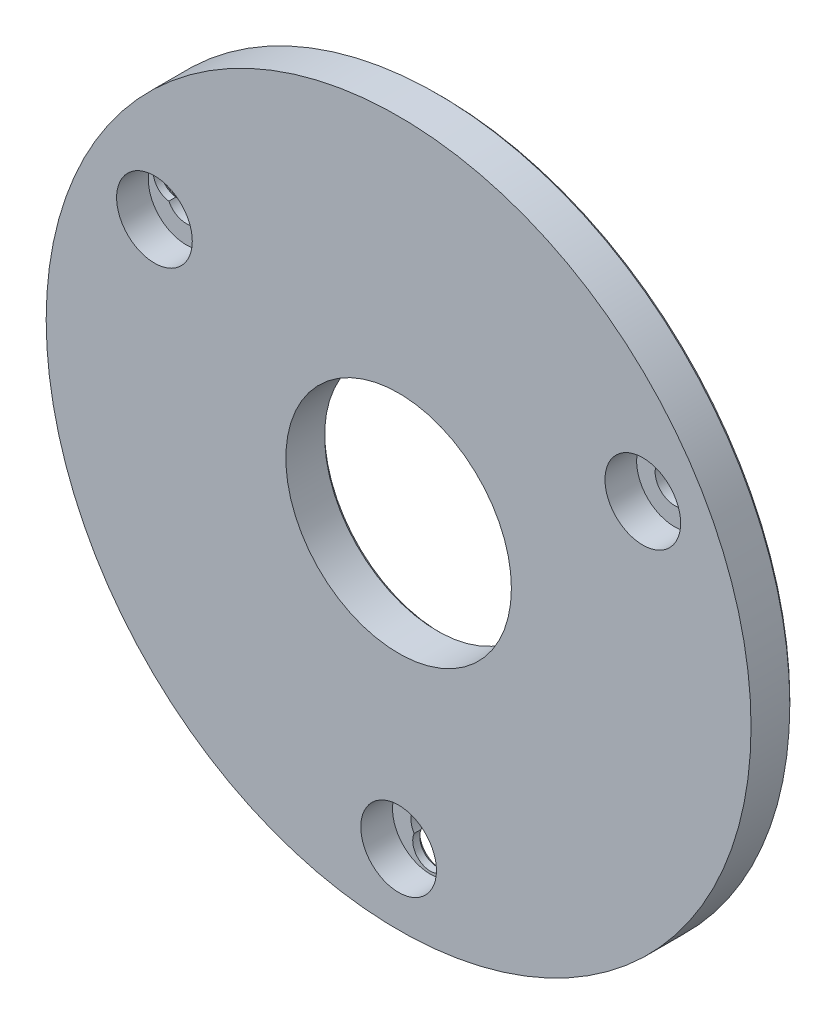
ISO-10303-21;
HEADER;
FILE_DESCRIPTION(('STEP AP214'),'2;1');
FILE_NAME('part.step','',(''),(''),'','','');
FILE_SCHEMA(('AUTOMOTIVE_DESIGN { 1 0 10303 214 1 1 1 1 }'));
ENDSEC;
DATA;
#1=APPLICATION_CONTEXT('core data for automotive mechanical design processes');
#2=APPLICATION_PROTOCOL_DEFINITION('international standard','automotive_design',2000,#1);
#3=PRODUCT_CONTEXT('',#1,'mechanical');
#4=PRODUCT('Part','Part','',(#3));
#5=PRODUCT_RELATED_PRODUCT_CATEGORY('part','',(#4));
#6=PRODUCT_DEFINITION_FORMATION('','',#4);
#7=PRODUCT_DEFINITION_CONTEXT('part definition',#1,'design');
#8=PRODUCT_DEFINITION('design','',#6,#7);
#9=PRODUCT_DEFINITION_SHAPE('','',#8);
#10=(LENGTH_UNIT() NAMED_UNIT(*) SI_UNIT(.MILLI.,.METRE.));
#11=(NAMED_UNIT(*) PLANE_ANGLE_UNIT() SI_UNIT($,.RADIAN.));
#12=(NAMED_UNIT(*) SI_UNIT($,.STERADIAN.) SOLID_ANGLE_UNIT());
#13=UNCERTAINTY_MEASURE_WITH_UNIT(LENGTH_MEASURE(1.E-05),#10,'distance_accuracy_value','');
#14=(GEOMETRIC_REPRESENTATION_CONTEXT(3) GLOBAL_UNCERTAINTY_ASSIGNED_CONTEXT((#13)) GLOBAL_UNIT_ASSIGNED_CONTEXT((#10,
#11,#12)) REPRESENTATION_CONTEXT('',''));
#15=CARTESIAN_POINT('',(0.,0.,0.));
#16=DIRECTION('',(0.,0.,1.));
#17=DIRECTION('',(1.,0.,0.));
#18=AXIS2_PLACEMENT_3D('',#15,#16,#17);
#19=CARTESIAN_POINT('',(0.,0.,12.));
#20=DIRECTION('',(0.,0.,1.));
#21=DIRECTION('',(1.,0.,0.));
#22=AXIS2_PLACEMENT_3D('',#19,#20,#21);
#23=PLANE('',#22);
#24=CARTESIAN_POINT('',(-69.2819235902142,40.0001882950536,12.));
#25=DIRECTION('',(0.,0.,1.));
#26=DIRECTION('',(1.,0.,0.));
#27=AXIS2_PLACEMENT_3D('',#24,#25,#26);
#28=CIRCLE('',#27,10.7375);
#29=CARTESIAN_POINT('',(-58.5444235902142,40.0001882950536,12.));
#30=VERTEX_POINT('',#29);
#31=EDGE_CURVE('E320',#30,#30,#28,.T.);
#32=ORIENTED_EDGE('',*,*,#31,.F.);
#33=EDGE_LOOP('',(#32));
#34=FACE_BOUND('',#33,.T.);
#35=CARTESIAN_POINT('',(-0.000217424570571681,-79.9999999997045,12.));
#36=DIRECTION('',(0.,0.,1.));
#37=DIRECTION('',(1.,0.,0.));
#38=AXIS2_PLACEMENT_3D('',#35,#36,#37);
#39=CIRCLE('',#38,10.7375);
#40=CARTESIAN_POINT('',(10.7372825754294,-79.9999999997045,12.));
#41=VERTEX_POINT('',#40);
#42=EDGE_CURVE('E311',#41,#41,#39,.T.);
#43=ORIENTED_EDGE('',*,*,#42,.F.);
#44=EDGE_LOOP('',(#43));
#45=FACE_BOUND('',#44,.T.);
#46=CARTESIAN_POINT('',(69.2821410147845,39.9998117046507,12.));
#47=DIRECTION('',(0.,0.,1.));
#48=DIRECTION('',(1.,0.,0.));
#49=AXIS2_PLACEMENT_3D('',#46,#47,#48);
#50=CIRCLE('',#49,10.7375);
#51=CARTESIAN_POINT('',(80.0196410147845,39.9998117046507,12.));
#52=VERTEX_POINT('',#51);
#53=EDGE_CURVE('E235',#52,#52,#50,.T.);
#54=ORIENTED_EDGE('',*,*,#53,.F.);
#55=EDGE_LOOP('',(#54));
#56=FACE_BOUND('',#55,.T.);
#57=CARTESIAN_POINT('',(0.,0.,12.));
#58=DIRECTION('',(0.,0.,1.));
#59=DIRECTION('',(1.,0.,0.));
#60=AXIS2_PLACEMENT_3D('',#57,#58,#59);
#61=CIRCLE('',#60,32.);
#62=CARTESIAN_POINT('',(32.,0.,12.));
#63=VERTEX_POINT('',#62);
#64=EDGE_CURVE('E254',#63,#63,#61,.T.);
#65=ORIENTED_EDGE('',*,*,#64,.F.);
#66=EDGE_LOOP('',(#65));
#67=FACE_BOUND('',#66,.T.);
#68=CARTESIAN_POINT('',(0.,0.,12.));
#69=DIRECTION('',(0.,0.,1.));
#70=DIRECTION('',(1.,0.,0.));
#71=AXIS2_PLACEMENT_3D('',#68,#69,#70);
#72=CIRCLE('',#71,100.);
#73=CARTESIAN_POINT('',(100.,0.,12.));
#74=VERTEX_POINT('',#73);
#75=EDGE_CURVE('E257',#74,#74,#72,.T.);
#76=ORIENTED_EDGE('',*,*,#75,.T.);
#77=EDGE_LOOP('',(#76));
#78=FACE_BOUND('',#77,.T.);
#79=ADVANCED_FACE('F35',(#34,#45,#56,#67,#78),#23,.T.);
#80=CARTESIAN_POINT('',(0.,0.,0.));
#81=DIRECTION('',(0.,0.,1.));
#82=DIRECTION('',(1.,0.,0.));
#83=AXIS2_PLACEMENT_3D('',#80,#81,#82);
#84=PLANE('',#83);
#85=CARTESIAN_POINT('',(1.42646739274691E-12,-84.9999999999993,0.));
#86=DIRECTION('',(0.,0.,1.));
#87=DIRECTION('',(1.,0.,0.));
#88=AXIS2_PLACEMENT_3D('',#85,#86,#87);
#89=CIRCLE('',#88,5.99999999999995);
#90=CARTESIAN_POINT('',(-5.15225705876379,-81.9252240406157,0.));
#91=VERTEX_POINT('',#90);
#92=CARTESIAN_POINT('',(5.15198962654319,-81.9247759613307,0.));
#93=VERTEX_POINT('',#92);
#94=EDGE_CURVE('E121',#91,#93,#89,.T.);
#95=ORIENTED_EDGE('',*,*,#94,.T.);
#96=CARTESIAN_POINT('',(-0.000217424570571681,-79.9999999997045,0.));
#97=DIRECTION('',(0.,0.,1.));
#98=DIRECTION('',(1.,0.,0.));
#99=AXIS2_PLACEMENT_3D('',#96,#97,#98);
#100=CIRCLE('',#99,5.50000000000001);
#101=EDGE_CURVE('E58',#93,#91,#100,.T.);
#102=ORIENTED_EDGE('',*,*,#101,.T.);
#103=EDGE_LOOP('',(#95,#102));
#104=FACE_BOUND('',#103,.T.);
#105=CARTESIAN_POINT('',(-73.6121593216774,42.4999999999998,0.));
#106=DIRECTION('',(0.,0.,1.));
#107=DIRECTION('',(1.,0.,0.));
#108=AXIS2_PLACEMENT_3D('',#105,#106,#107);
#109=CIRCLE('',#108,5.99999999999989);
#110=CARTESIAN_POINT('',(-68.373196700522,45.4245975200246,0.));
#111=VERTEX_POINT('',#110);
#112=CARTESIAN_POINT('',(-73.5249319951342,36.5006340840464,0.));
#113=VERTEX_POINT('',#112);
#114=EDGE_CURVE('E116',#111,#113,#109,.T.);
#115=ORIENTED_EDGE('',*,*,#114,.T.);
#116=CARTESIAN_POINT('',(-69.2819235902142,40.0001882950536,0.));
#117=DIRECTION('',(0.,0.,1.));
#118=DIRECTION('',(1.,0.,0.));
#119=AXIS2_PLACEMENT_3D('',#116,#117,#118);
#120=CIRCLE('',#119,5.50000000000001);
#121=EDGE_CURVE('E50',#113,#111,#120,.T.);
#122=ORIENTED_EDGE('',*,*,#121,.T.);
#123=EDGE_LOOP('',(#115,#122));
#124=FACE_BOUND('',#123,.T.);
#125=CARTESIAN_POINT('',(73.6121593216772,42.5000000000016,0.));
#126=DIRECTION('',(0.,0.,1.));
#127=DIRECTION('',(1.,0.,0.));
#128=AXIS2_PLACEMENT_3D('',#125,#126,#127);
#129=CIRCLE('',#128,5.99999999999998);
#130=CARTESIAN_POINT('',(73.5254537592873,36.5006265205914,0.));
#131=VERTEX_POINT('',#130);
#132=CARTESIAN_POINT('',(68.3729423685902,45.4241418772857,0.));
#133=VERTEX_POINT('',#132);
#134=EDGE_CURVE('E122',#131,#133,#129,.T.);
#135=ORIENTED_EDGE('',*,*,#134,.T.);
#136=CARTESIAN_POINT('',(69.2821410147845,39.9998117046507,0.));
#137=DIRECTION('',(0.,0.,1.));
#138=DIRECTION('',(1.,0.,0.));
#139=AXIS2_PLACEMENT_3D('',#136,#137,#138);
#140=CIRCLE('',#139,5.50000000000001);
#141=EDGE_CURVE('E247',#133,#131,#140,.T.);
#142=ORIENTED_EDGE('',*,*,#141,.T.);
#143=EDGE_LOOP('',(#135,#142));
#144=FACE_BOUND('',#143,.T.);
#145=CARTESIAN_POINT('',(0.,0.,0.));
#146=DIRECTION('',(0.,0.,1.));
#147=DIRECTION('',(1.,0.,0.));
#148=AXIS2_PLACEMENT_3D('',#145,#146,#147);
#149=CIRCLE('',#148,32.9999999999999);
#150=CARTESIAN_POINT('',(32.9999999999999,0.,0.));
#151=VERTEX_POINT('',#150);
#152=EDGE_CURVE('E128',#151,#151,#149,.T.);
#153=ORIENTED_EDGE('',*,*,#152,.T.);
#154=EDGE_LOOP('',(#153));
#155=FACE_BOUND('',#154,.T.);
#156=CARTESIAN_POINT('',(0.,0.,0.));
#157=DIRECTION('',(0.,0.,1.));
#158=DIRECTION('',(1.,0.,0.));
#159=AXIS2_PLACEMENT_3D('',#156,#157,#158);
#160=CIRCLE('',#159,99.);
#161=CARTESIAN_POINT('',(99.,0.,0.));
#162=VERTEX_POINT('',#161);
#163=EDGE_CURVE('E260',#162,#162,#160,.F.);
#164=ORIENTED_EDGE('',*,*,#163,.T.);
#165=EDGE_LOOP('',(#164));
#166=FACE_BOUND('',#165,.T.);
#167=ADVANCED_FACE('F114',(#104,#124,#144,#155,#166),#84,.F.);
#168=CARTESIAN_POINT('',(0.,0.,12.));
#169=DIRECTION('',(0.,0.,-1.));
#170=DIRECTION('',(-1.,0.,0.));
#171=AXIS2_PLACEMENT_3D('',#168,#169,#170);
#172=CYLINDRICAL_SURFACE('',#171,100.);
#173=CARTESIAN_POINT('',(0.,0.,0.999999999999959));
#174=DIRECTION('',(0.,0.,1.));
#175=DIRECTION('',(1.,0.,0.));
#176=AXIS2_PLACEMENT_3D('',#173,#174,#175);
#177=CIRCLE('',#176,100.);
#178=CARTESIAN_POINT('',(100.,0.,0.999999999999959));
#179=VERTEX_POINT('',#178);
#180=EDGE_CURVE('E142',#179,#179,#177,.T.);
#181=ORIENTED_EDGE('',*,*,#180,.T.);
#182=EDGE_LOOP('',(#181));
#183=FACE_BOUND('',#182,.T.);
#184=ORIENTED_EDGE('',*,*,#75,.F.);
#185=EDGE_LOOP('',(#184));
#186=FACE_BOUND('',#185,.T.);
#187=ADVANCED_FACE('F185',(#183,#186),#172,.T.);
#188=CARTESIAN_POINT('',(0.,0.,12.));
#189=DIRECTION('',(0.,0.,-1.));
#190=DIRECTION('',(-1.,0.,0.));
#191=AXIS2_PLACEMENT_3D('',#188,#189,#190);
#192=CYLINDRICAL_SURFACE('',#191,32.);
#193=CARTESIAN_POINT('',(0.,0.,0.999999999999952));
#194=DIRECTION('',(0.,0.,1.));
#195=DIRECTION('',(1.,0.,0.));
#196=AXIS2_PLACEMENT_3D('',#193,#194,#195);
#197=CIRCLE('',#196,32.);
#198=CARTESIAN_POINT('',(32.,0.,0.999999999999952));
#199=VERTEX_POINT('',#198);
#200=EDGE_CURVE('E139',#199,#199,#197,.F.);
#201=ORIENTED_EDGE('',*,*,#200,.T.);
#202=EDGE_LOOP('',(#201));
#203=FACE_BOUND('',#202,.T.);
#204=ORIENTED_EDGE('',*,*,#64,.T.);
#205=EDGE_LOOP('',(#204));
#206=FACE_BOUND('',#205,.T.);
#207=ADVANCED_FACE('F181',(#203,#206),#192,.F.);
#208=CARTESIAN_POINT('',(-73.6121593216774,42.4999999999998,12.));
#209=DIRECTION('',(0.,0.,-1.));
#210=DIRECTION('',(-1.,0.,0.));
#211=AXIS2_PLACEMENT_3D('',#208,#209,#210);
#212=CYLINDRICAL_SURFACE('',#211,4.99999999999998);
#213=DIRECTION('',(0.,0.,1.));
#214=VECTOR('',#213,1.);
#215=CARTESIAN_POINT('',(-74.1982460204323,37.5344685700779,1.49999999999999));
#216=LINE('',#215,#214);
#217=CARTESIAN_POINT('',(-74.1982460204323,37.5344685700779,0.999999999999932));
#218=VERTEX_POINT('',#217);
#219=CARTESIAN_POINT('',(-74.1982460204323,37.5344685700779,2.99999999999998));
#220=VERTEX_POINT('',#219);
#221=EDGE_CURVE('E117',#218,#220,#216,.T.);
#222=ORIENTED_EDGE('',*,*,#221,.F.);
#223=CARTESIAN_POINT('',(-73.6121593216774,42.4999999999998,0.999999999999931));
#224=DIRECTION('',(0.,0.,1.));
#225=DIRECTION('',(1.,0.,0.));
#226=AXIS2_PLACEMENT_3D('',#223,#224,#225);
#227=CIRCLE('',#226,4.99999999999998);
#228=CARTESIAN_POINT('',(-69.6051863932397,45.4906801819596,0.999999999999935));
#229=VERTEX_POINT('',#228);
#230=EDGE_CURVE('E134',#218,#229,#227,.F.);
#231=ORIENTED_EDGE('',*,*,#230,.T.);
#232=DIRECTION('',(0.,0.,1.));
#233=VECTOR('',#232,1.);
#234=CARTESIAN_POINT('',(-69.6051863932397,45.4906801819596,1.49999999999999));
#235=LINE('',#234,#233);
#236=CARTESIAN_POINT('',(-69.6051863932397,45.4906801819596,2.99999999999998));
#237=VERTEX_POINT('',#236);
#238=EDGE_CURVE('E106',#237,#229,#235,.F.);
#239=ORIENTED_EDGE('',*,*,#238,.F.);
#240=CARTESIAN_POINT('',(-73.6121593216774,42.4999999999998,2.99999999999998));
#241=DIRECTION('',(0.,0.,-1.));
#242=DIRECTION('',(-1.,0.,0.));
#243=AXIS2_PLACEMENT_3D('',#240,#241,#242);
#244=CIRCLE('',#243,4.99999999999998);
#245=EDGE_CURVE('E11',#220,#237,#244,.T.);
#246=ORIENTED_EDGE('',*,*,#245,.F.);
#247=EDGE_LOOP('',(#222,#231,#239,#246));
#248=FACE_BOUND('',#247,.T.);
#249=ADVANCED_FACE('F177',(#248),#212,.F.);
#250=CARTESIAN_POINT('',(73.6121593216772,42.5000000000016,12.));
#251=DIRECTION('',(0.,0.,-1.));
#252=DIRECTION('',(-1.,0.,0.));
#253=AXIS2_PLACEMENT_3D('',#250,#251,#252);
#254=CYLINDRICAL_SURFACE('',#253,5.00000000000001);
#255=DIRECTION('',(0.,0.,1.));
#256=VECTOR('',#255,1.);
#257=CARTESIAN_POINT('',(69.6049263094508,45.4903316849027,1.49999999999999));
#258=LINE('',#257,#256);
#259=CARTESIAN_POINT('',(69.6049263094508,45.4903316849027,0.999999999999962));
#260=VERTEX_POINT('',#259);
#261=CARTESIAN_POINT('',(69.6049263094508,45.4903316849027,2.99999999999998));
#262=VERTEX_POINT('',#261);
#263=EDGE_CURVE('E250',#260,#262,#258,.T.);
#264=ORIENTED_EDGE('',*,*,#263,.F.);
#265=CARTESIAN_POINT('',(73.6121593216772,42.5000000000016,0.999999999999963));
#266=DIRECTION('',(0.,0.,1.));
#267=DIRECTION('',(1.,0.,0.));
#268=AXIS2_PLACEMENT_3D('',#265,#266,#267);
#269=CIRCLE('',#268,5.00000000000001);
#270=CARTESIAN_POINT('',(74.1986778696311,37.5345195607182,0.999999999999962));
#271=VERTEX_POINT('',#270);
#272=EDGE_CURVE('E136',#260,#271,#269,.F.);
#273=ORIENTED_EDGE('',*,*,#272,.T.);
#274=DIRECTION('',(0.,0.,1.));
#275=VECTOR('',#274,1.);
#276=CARTESIAN_POINT('',(74.1986778696311,37.5345195607182,1.49999999999999));
#277=LINE('',#276,#275);
#278=CARTESIAN_POINT('',(74.1986778696311,37.5345195607182,2.99999999999998));
#279=VERTEX_POINT('',#278);
#280=EDGE_CURVE('E252',#279,#271,#277,.F.);
#281=ORIENTED_EDGE('',*,*,#280,.F.);
#282=CARTESIAN_POINT('',(73.6121593216772,42.5000000000016,2.99999999999998));
#283=DIRECTION('',(0.,0.,-1.));
#284=DIRECTION('',(-1.,0.,0.));
#285=AXIS2_PLACEMENT_3D('',#282,#283,#284);
#286=CIRCLE('',#285,5.00000000000001);
#287=EDGE_CURVE('E290',#262,#279,#286,.T.);
#288=ORIENTED_EDGE('',*,*,#287,.F.);
#289=EDGE_LOOP('',(#264,#273,#281,#288));
#290=FACE_BOUND('',#289,.T.);
#291=ADVANCED_FACE('F173',(#290),#254,.F.);
#292=CARTESIAN_POINT('',(1.42646739274691E-12,-84.9999999999993,12.));
#293=DIRECTION('',(0.,0.,-1.));
#294=DIRECTION('',(-1.,0.,0.));
#295=AXIS2_PLACEMENT_3D('',#292,#293,#294);
#296=CYLINDRICAL_SURFACE('',#295,5.);
#297=DIRECTION('',(0.,0.,1.));
#298=VECTOR('',#297,1.);
#299=CARTESIAN_POINT('',(4.5933197109809,-83.0248002549792,1.49999999999999));
#300=LINE('',#299,#298);
#301=CARTESIAN_POINT('',(4.5933197109809,-83.0248002549792,0.999999999999958));
#302=VERTEX_POINT('',#301);
#303=CARTESIAN_POINT('',(4.5933197109809,-83.0248002549792,2.99999999999998));
#304=VERTEX_POINT('',#303);
#305=EDGE_CURVE('E241',#302,#304,#300,.T.);
#306=ORIENTED_EDGE('',*,*,#305,.F.);
#307=CARTESIAN_POINT('',(1.42646739274691E-12,-84.9999999999993,0.999999999999956));
#308=DIRECTION('',(0.,0.,1.));
#309=DIRECTION('',(1.,0.,0.));
#310=AXIS2_PLACEMENT_3D('',#307,#308,#309);
#311=CIRCLE('',#310,5.);
#312=CARTESIAN_POINT('',(-4.59349147639002,-83.0251997426773,0.999999999999957));
#313=VERTEX_POINT('',#312);
#314=EDGE_CURVE('E125',#302,#313,#311,.F.);
#315=ORIENTED_EDGE('',*,*,#314,.T.);
#316=DIRECTION('',(0.,0.,1.));
#317=VECTOR('',#316,1.);
#318=CARTESIAN_POINT('',(-4.59349147639002,-83.0251997426773,1.49999999999999));
#319=LINE('',#318,#317);
#320=CARTESIAN_POINT('',(-4.59349147639002,-83.0251997426773,2.99999999999998));
#321=VERTEX_POINT('',#320);
#322=EDGE_CURVE('E237',#321,#313,#319,.F.);
#323=ORIENTED_EDGE('',*,*,#322,.F.);
#324=CARTESIAN_POINT('',(1.42646739274691E-12,-84.9999999999993,2.99999999999998));
#325=DIRECTION('',(0.,0.,-1.));
#326=DIRECTION('',(-1.,0.,0.));
#327=AXIS2_PLACEMENT_3D('',#324,#325,#326);
#328=CIRCLE('',#327,5.);
#329=EDGE_CURVE('E213',#304,#321,#328,.T.);
#330=ORIENTED_EDGE('',*,*,#329,.F.);
#331=EDGE_LOOP('',(#306,#315,#323,#330));
#332=FACE_BOUND('',#331,.T.);
#333=ADVANCED_FACE('F168',(#332),#296,.F.);
#334=CARTESIAN_POINT('',(1.42646739274691E-12,-84.9999999999993,0.));
#335=DIRECTION('',(0.,0.,-1.));
#336=DIRECTION('',(-1.,0.,0.));
#337=AXIS2_PLACEMENT_3D('',#334,#335,#336);
#338=CONICAL_SURFACE('',#337,5.99999999999995,0.785398163397443);
#339=CARTESIAN_POINT('',(-4.59335975353036,-83.0253997329494,1.00020000000003));
#340=CARTESIAN_POINT('',(-4.64938518841113,-82.9403447745221,0.915137248182695));
#341=CARTESIAN_POINT('',(-4.70321417607477,-82.8534762334235,0.830435653427261));
#342=CARTESIAN_POINT('',(-4.80614415923721,-82.6764762240691,0.661985130890068));
#343=CARTESIAN_POINT('',(-4.85525427376078,-82.5863515319141,0.578234653184144));
#344=CARTESIAN_POINT('',(-4.948635825718,-82.4028633517617,0.411577856923276));
#345=CARTESIAN_POINT('',(-4.99290710673725,-82.3094997591958,0.328671565735015));
#346=CARTESIAN_POINT('',(-5.07646155801662,-82.119560171441,0.163611086659927));
#347=CARTESIAN_POINT('',(-5.11573469359752,-82.0229781901647,0.0814587097540616));
#348=CARTESIAN_POINT('',(-5.15234673609067,-81.9249840405151,-0.000200000000152951));
#349=B_SPLINE_CURVE_WITH_KNOTS('',3,(#339,#340,#341,#342,#343,#344,#345,#346,#347,#348),
.UNSPECIFIED.,.F.,.F.,(4,2,2,2,4),(0.,0.398069414421475,0.795353416916052,1.19265025774677,
1.59073256587031),.UNSPECIFIED.);
#350=EDGE_CURVE('E208',#313,#91,#349,.T.);
#351=ORIENTED_EDGE('',*,*,#350,.F.);
#352=ORIENTED_EDGE('',*,*,#314,.F.);
#353=CARTESIAN_POINT('',(5.15207928299696,-81.9245359534318,-0.000200000000149351));
#354=CARTESIAN_POINT('',(5.11547576317667,-82.0225332868538,0.0814587097540694));
#355=CARTESIAN_POINT('',(5.07621102746266,-82.1191186833428,0.163611086659935));
#356=CARTESIAN_POINT('',(4.99267309551268,-82.3090655370955,0.328671565735021));
#357=CARTESIAN_POINT('',(4.9484099344765,-82.402432979574,0.411577856923281));
#358=CARTESIAN_POINT('',(4.85504434080802,-82.5859292804101,0.578234653184144));
#359=CARTESIAN_POINT('',(4.80594206459921,-82.6760582433225,0.661985130890067));
#360=CARTESIAN_POINT('',(4.70302747548653,-82.8530672038105,0.83043565342726));
#361=CARTESIAN_POINT('',(4.64920604296859,-82.9399404260783,0.915137248182697));
#362=CARTESIAN_POINT('',(4.59318800551486,-83.0250002567065,1.00020000000004));
#363=B_SPLINE_CURVE_WITH_KNOTS('',3,(#353,#354,#355,#356,#357,#358,#359,#360,#361,#362),
.UNSPECIFIED.,.F.,.F.,(4,2,2,2,4),(0.,0.398082308123537,0.795379148954256,1.19266315144882,
1.59073256587031),.UNSPECIFIED.);
#364=EDGE_CURVE('E202',#93,#302,#363,.T.);
#365=ORIENTED_EDGE('',*,*,#364,.F.);
#366=ORIENTED_EDGE('',*,*,#94,.F.);
#367=EDGE_LOOP('',(#351,#352,#365,#366));
#368=FACE_BOUND('',#367,.T.);
#369=ADVANCED_FACE('F172',(#368),#338,.F.);
#370=CARTESIAN_POINT('',(-73.6121593216774,42.4999999999998,0.));
#371=DIRECTION('',(0.,0.,-1.));
#372=DIRECTION('',(-1.,0.,0.));
#373=AXIS2_PLACEMENT_3D('',#370,#371,#372);
#374=CONICAL_SURFACE('',#373,5.99999999999989,0.78539816339744);
#375=CARTESIAN_POINT('',(-69.6054254513255,45.4906661017529,1.00019999999989));
#376=CARTESIAN_POINT('',(-69.5037529791692,45.496658072404,0.915137248182577));
#377=CARTESIAN_POINT('',(-69.4016081219564,45.4998410726315,0.830435653427165));
#378=CARTESIAN_POINT('',(-69.1968566258043,45.500481048184,0.66198513089002));
#379=CARTESIAN_POINT('',(-69.0942512956281,45.4979493088666,0.57823465318412));
#380=CARTESIAN_POINT('',(-68.8886550943434,45.4870760150301,0.411577856923302));
#381=CARTESIAN_POINT('',(-68.7856642108831,45.4787342727679,0.328671565735065));
#382=CARTESIAN_POINT('',(-68.5793944770636,45.4561247562977,0.16361108666003));
#383=CARTESIAN_POINT('',(-68.47611545994,45.4418452987588,0.0814587097541932));
#384=CARTESIAN_POINT('',(-68.3729440156747,45.4245551828176,-0.000200000000001117));
#385=B_SPLINE_CURVE_WITH_KNOTS('',3,(#375,#376,#377,#378,#379,#380,#381,#382,#383,#384),
.UNSPECIFIED.,.F.,.F.,(4,2,2,2,4),(0.,0.398069414421348,0.795353416915767,1.19265025774636,
1.59073256586974),.UNSPECIFIED.);
#386=EDGE_CURVE('E43',#229,#111,#385,.T.);
#387=ORIENTED_EDGE('',*,*,#386,.F.);
#388=ORIENTED_EDGE('',*,*,#230,.F.);
#389=CARTESIAN_POINT('',(-73.5247689704237,36.5004364353306,-0.000200000000002834));
#390=CARTESIAN_POINT('',(-73.59133539076,36.5811346800739,0.0814587097541929));
#391=CARTESIAN_POINT('',(-73.655348429897,36.6634316369196,0.163611086660036));
#392=CARTESIAN_POINT('',(-73.7780782646407,36.8307510350442,0.328671565735082));
#393=CARTESIAN_POINT('',(-73.8368052611954,36.9157677781926,0.411577856923322));
#394=CARTESIAN_POINT('',(-73.9490349223856,37.088372904567,0.578234653184147));
#395=CARTESIAN_POINT('',(-74.00253775578,37.1759612046036,0.66198513089005));
#396=CARTESIAN_POINT('',(-74.1043747177036,37.3535923334392,0.830435653427201));
#397=CARTESIAN_POINT('',(-74.1526984188372,37.4436396724017,0.915137248182615));
#398=CARTESIAN_POINT('',(-74.1983533742758,37.5346826312208,1.00019999999993));
#399=B_SPLINE_CURVE_WITH_KNOTS('',3,(#389,#390,#391,#392,#393,#394,#395,#396,#397,#398),
.UNSPECIFIED.,.F.,.F.,(4,2,2,2,4),(0.,0.398082308123407,0.795379148954008,1.19266315144846,
1.59073256586981),.UNSPECIFIED.);
#400=EDGE_CURVE('E111',#113,#218,#399,.T.);
#401=ORIENTED_EDGE('',*,*,#400,.F.);
#402=ORIENTED_EDGE('',*,*,#114,.F.);
#403=EDGE_LOOP('',(#387,#388,#401,#402));
#404=FACE_BOUND('',#403,.T.);
#405=ADVANCED_FACE('F120',(#404),#374,.F.);
#406=CARTESIAN_POINT('',(73.6121593216772,42.5000000000016,0.));
#407=DIRECTION('',(0.,0.,-1.));
#408=DIRECTION('',(-1.,0.,0.));
#409=AXIS2_PLACEMENT_3D('',#406,#407,#408);
#410=CONICAL_SURFACE('',#409,5.99999999999998,0.785398163397453);
#411=CARTESIAN_POINT('',(74.1987852048574,37.5347336311969,1.00019999999997));
#412=CARTESIAN_POINT('',(74.1531381675819,37.4436867021185,0.915137248182649));
#413=CARTESIAN_POINT('',(74.1048222980328,37.3536351607925,0.83043565342723));
#414=CARTESIAN_POINT('',(74.003000785043,37.1759951758856,0.661985130890073));
#415=CARTESIAN_POINT('',(73.9495055693904,37.088402223048,0.578234653184167));
#416=CARTESIAN_POINT('',(73.8372909200629,36.915787336732,0.411577856923334));
#417=CARTESIAN_POINT('',(73.7785713176219,36.8307654864283,0.328671565735089));
#418=CARTESIAN_POINT('',(73.6558560350817,36.6634354151438,0.163611086660039));
#419=CARTESIAN_POINT('',(73.591850153539,36.5811328914063,0.081458709754196));
#420=CARTESIAN_POINT('',(73.5252907517669,36.5004288576981,-0.000200000000001914));
#421=B_SPLINE_CURVE_WITH_KNOTS('',3,(#411,#412,#413,#414,#415,#416,#417,#418,#419,#420),
.UNSPECIFIED.,.F.,.F.,(4,2,2,2,4),(0.,0.398069414421354,0.795353416915784,1.19265025774639,
1.59073256586977),.UNSPECIFIED.);
#422=EDGE_CURVE('E152',#271,#131,#421,.T.);
#423=ORIENTED_EDGE('',*,*,#422,.F.);
#424=ORIENTED_EDGE('',*,*,#272,.F.);
#425=CARTESIAN_POINT('',(68.372689687426,45.4240995181029,-0.000199999999996162));
#426=CARTESIAN_POINT('',(68.4758596275827,45.4413986067815,0.0814587097542012));
#427=CARTESIAN_POINT('',(68.5791374024337,45.4556870464248,0.163611086660047));
#428=CARTESIAN_POINT('',(68.7854051691274,45.4783145020528,0.328671565735096));
#429=CARTESIAN_POINT('',(68.8883953267182,45.4866652013829,0.411577856923337));
#430=CARTESIAN_POINT('',(69.0939905815769,45.4975563758446,0.57823465318416));
#431=CARTESIAN_POINT('',(69.1965956911801,45.5000970387203,0.661985130890062));
#432=CARTESIAN_POINT('',(69.4013472422165,45.4994748703727,0.830435653427216));
#433=CARTESIAN_POINT('',(69.503492375868,45.496300753678,0.915137248182636));
#434=CARTESIAN_POINT('',(69.6051653687604,45.490317625487,1.00019999999996));
#435=B_SPLINE_CURVE_WITH_KNOTS('',3,(#425,#426,#427,#428,#429,#430,#431,#432,#433,#434),
.UNSPECIFIED.,.F.,.F.,(4,2,2,2,4),(0.,0.398082308123394,0.795379148953966,1.19266315144838,
1.59073256586974),.UNSPECIFIED.);
#436=EDGE_CURVE('E145',#133,#260,#435,.T.);
#437=ORIENTED_EDGE('',*,*,#436,.F.);
#438=ORIENTED_EDGE('',*,*,#134,.F.);
#439=EDGE_LOOP('',(#423,#424,#437,#438));
#440=FACE_BOUND('',#439,.T.);
#441=ADVANCED_FACE('F157',(#440),#410,.F.);
#442=CARTESIAN_POINT('',(0.,0.,0.));
#443=DIRECTION('',(0.,0.,-1.));
#444=DIRECTION('',(-1.,0.,0.));
#445=AXIS2_PLACEMENT_3D('',#442,#443,#444);
#446=CONICAL_SURFACE('',#445,32.9999999999999,0.785398163397445);
#447=ORIENTED_EDGE('',*,*,#200,.F.);
#448=EDGE_LOOP('',(#447));
#449=FACE_BOUND('',#448,.T.);
#450=ORIENTED_EDGE('',*,*,#152,.F.);
#451=EDGE_LOOP('',(#450));
#452=FACE_BOUND('',#451,.T.);
#453=ADVANCED_FACE('F267',(#449,#452),#446,.F.);
#454=CARTESIAN_POINT('',(0.,0.,0.999999999999959));
#455=DIRECTION('',(0.,0.,1.));
#456=DIRECTION('',(1.,0.,0.));
#457=AXIS2_PLACEMENT_3D('',#454,#455,#456);
#458=CONICAL_SURFACE('',#457,100.,0.785398163397462);
#459=ORIENTED_EDGE('',*,*,#163,.F.);
#460=EDGE_LOOP('',(#459));
#461=FACE_BOUND('',#460,.T.);
#462=ORIENTED_EDGE('',*,*,#180,.F.);
#463=EDGE_LOOP('',(#462));
#464=FACE_BOUND('',#463,.T.);
#465=ADVANCED_FACE('F37',(#461,#464),#458,.T.);
#466=CARTESIAN_POINT('',(69.2821410147845,39.9998117046507,12.));
#467=DIRECTION('',(0.,0.,1.));
#468=DIRECTION('',(1.,0.,0.));
#469=AXIS2_PLACEMENT_3D('',#466,#467,#468);
#470=CYLINDRICAL_SURFACE('',#469,5.50000000000001);
#471=ORIENTED_EDGE('',*,*,#280,.T.);
#472=ORIENTED_EDGE('',*,*,#422,.T.);
#473=ORIENTED_EDGE('',*,*,#141,.F.);
#474=ORIENTED_EDGE('',*,*,#436,.T.);
#475=ORIENTED_EDGE('',*,*,#263,.T.);
#476=CARTESIAN_POINT('',(69.2821410147845,39.9998117046507,2.99999999999998));
#477=DIRECTION('',(0.,0.,1.));
#478=DIRECTION('',(1.,0.,0.));
#479=AXIS2_PLACEMENT_3D('',#476,#477,#478);
#480=CIRCLE('',#479,5.50000000000001);
#481=EDGE_CURVE('E239',#262,#279,#480,.T.);
#482=ORIENTED_EDGE('',*,*,#481,.T.);
#483=EDGE_LOOP('',(#471,#472,#473,#474,#475,#482));
#484=FACE_BOUND('',#483,.T.);
#485=ADVANCED_FACE('F160',(#484),#470,.F.);
#486=CARTESIAN_POINT('',(74.7821410147845,39.9998117046507,2.99999999999998));
#487=DIRECTION('',(0.,0.,-1.));
#488=DIRECTION('',(-1.,0.,0.));
#489=AXIS2_PLACEMENT_3D('',#486,#487,#488);
#490=PLANE('',#489);
#491=ORIENTED_EDGE('',*,*,#287,.T.);
#492=ORIENTED_EDGE('',*,*,#481,.F.);
#493=EDGE_LOOP('',(#491,#492));
#494=FACE_BOUND('',#493,.T.);
#495=CARTESIAN_POINT('',(69.2821410147845,39.9998117046507,2.99999999999998));
#496=DIRECTION('',(0.,0.,1.));
#497=DIRECTION('',(1.,0.,0.));
#498=AXIS2_PLACEMENT_3D('',#495,#496,#497);
#499=CIRCLE('',#498,10.7375);
#500=CARTESIAN_POINT('',(80.0196410147845,39.9998117046507,2.99999999999998));
#501=VERTEX_POINT('',#500);
#502=EDGE_CURVE('E232',#501,#501,#499,.T.);
#503=ORIENTED_EDGE('',*,*,#502,.T.);
#504=EDGE_LOOP('',(#503));
#505=FACE_BOUND('',#504,.T.);
#506=ADVANCED_FACE('F165',(#494,#505),#490,.F.);
#507=CARTESIAN_POINT('',(69.2821410147845,39.9998117046507,12.));
#508=DIRECTION('',(0.,0.,1.));
#509=DIRECTION('',(1.,0.,0.));
#510=AXIS2_PLACEMENT_3D('',#507,#508,#509);
#511=CYLINDRICAL_SURFACE('',#510,10.7375);
#512=ORIENTED_EDGE('',*,*,#502,.F.);
#513=EDGE_LOOP('',(#512));
#514=FACE_BOUND('',#513,.T.);
#515=ORIENTED_EDGE('',*,*,#53,.T.);
#516=EDGE_LOOP('',(#515));
#517=FACE_BOUND('',#516,.T.);
#518=ADVANCED_FACE('F220',(#514,#517),#511,.F.);
#519=CARTESIAN_POINT('',(-0.000217424570571681,-79.9999999997045,12.));
#520=DIRECTION('',(0.,0.,1.));
#521=DIRECTION('',(1.,0.,0.));
#522=AXIS2_PLACEMENT_3D('',#519,#520,#521);
#523=CYLINDRICAL_SURFACE('',#522,5.50000000000001);
#524=ORIENTED_EDGE('',*,*,#322,.T.);
#525=ORIENTED_EDGE('',*,*,#350,.T.);
#526=ORIENTED_EDGE('',*,*,#101,.F.);
#527=ORIENTED_EDGE('',*,*,#364,.T.);
#528=ORIENTED_EDGE('',*,*,#305,.T.);
#529=CARTESIAN_POINT('',(-0.000217424570571681,-79.9999999997045,2.99999999999998));
#530=DIRECTION('',(0.,0.,1.));
#531=DIRECTION('',(1.,0.,0.));
#532=AXIS2_PLACEMENT_3D('',#529,#530,#531);
#533=CIRCLE('',#532,5.50000000000001);
#534=EDGE_CURVE('E304',#304,#321,#533,.T.);
#535=ORIENTED_EDGE('',*,*,#534,.T.);
#536=EDGE_LOOP('',(#524,#525,#526,#527,#528,#535));
#537=FACE_BOUND('',#536,.T.);
#538=ADVANCED_FACE('F215',(#537),#523,.F.);
#539=CARTESIAN_POINT('',(5.49978257542944,-79.9999999997045,2.99999999999998));
#540=DIRECTION('',(0.,0.,-1.));
#541=DIRECTION('',(-1.,0.,0.));
#542=AXIS2_PLACEMENT_3D('',#539,#540,#541);
#543=PLANE('',#542);
#544=ORIENTED_EDGE('',*,*,#329,.T.);
#545=ORIENTED_EDGE('',*,*,#534,.F.);
#546=EDGE_LOOP('',(#544,#545));
#547=FACE_BOUND('',#546,.T.);
#548=CARTESIAN_POINT('',(-0.000217424570571681,-79.9999999997045,2.99999999999998));
#549=DIRECTION('',(0.,0.,1.));
#550=DIRECTION('',(1.,0.,0.));
#551=AXIS2_PLACEMENT_3D('',#548,#549,#550);
#552=CIRCLE('',#551,10.7375);
#553=CARTESIAN_POINT('',(10.7372825754294,-79.9999999997045,2.99999999999998));
#554=VERTEX_POINT('',#553);
#555=EDGE_CURVE('E306',#554,#554,#552,.T.);
#556=ORIENTED_EDGE('',*,*,#555,.T.);
#557=EDGE_LOOP('',(#556));
#558=FACE_BOUND('',#557,.T.);
#559=ADVANCED_FACE('F219',(#547,#558),#543,.F.);
#560=CARTESIAN_POINT('',(-0.000217424570571681,-79.9999999997045,12.));
#561=DIRECTION('',(0.,0.,1.));
#562=DIRECTION('',(1.,0.,0.));
#563=AXIS2_PLACEMENT_3D('',#560,#561,#562);
#564=CYLINDRICAL_SURFACE('',#563,10.7375);
#565=ORIENTED_EDGE('',*,*,#555,.F.);
#566=EDGE_LOOP('',(#565));
#567=FACE_BOUND('',#566,.T.);
#568=ORIENTED_EDGE('',*,*,#42,.T.);
#569=EDGE_LOOP('',(#568));
#570=FACE_BOUND('',#569,.T.);
#571=ADVANCED_FACE('F328',(#567,#570),#564,.F.);
#572=CARTESIAN_POINT('',(-69.2819235902142,40.0001882950536,12.));
#573=DIRECTION('',(0.,0.,1.));
#574=DIRECTION('',(1.,0.,0.));
#575=AXIS2_PLACEMENT_3D('',#572,#573,#574);
#576=CYLINDRICAL_SURFACE('',#575,5.50000000000001);
#577=ORIENTED_EDGE('',*,*,#238,.T.);
#578=ORIENTED_EDGE('',*,*,#386,.T.);
#579=ORIENTED_EDGE('',*,*,#121,.F.);
#580=ORIENTED_EDGE('',*,*,#400,.T.);
#581=ORIENTED_EDGE('',*,*,#221,.T.);
#582=CARTESIAN_POINT('',(-69.2819235902142,40.0001882950536,2.99999999999998));
#583=DIRECTION('',(0.,0.,1.));
#584=DIRECTION('',(1.,0.,0.));
#585=AXIS2_PLACEMENT_3D('',#582,#583,#584);
#586=CIRCLE('',#585,5.50000000000001);
#587=EDGE_CURVE('E118',#220,#237,#586,.T.);
#588=ORIENTED_EDGE('',*,*,#587,.T.);
#589=EDGE_LOOP('',(#577,#578,#579,#580,#581,#588));
#590=FACE_BOUND('',#589,.T.);
#591=ADVANCED_FACE('F103',(#590),#576,.F.);
#592=CARTESIAN_POINT('',(-63.7819235902142,40.0001882950536,2.99999999999998));
#593=DIRECTION('',(0.,0.,-1.));
#594=DIRECTION('',(-1.,0.,0.));
#595=AXIS2_PLACEMENT_3D('',#592,#593,#594);
#596=PLANE('',#595);
#597=ORIENTED_EDGE('',*,*,#245,.T.);
#598=ORIENTED_EDGE('',*,*,#587,.F.);
#599=EDGE_LOOP('',(#597,#598));
#600=FACE_BOUND('',#599,.T.);
#601=CARTESIAN_POINT('',(-69.2819235902142,40.0001882950536,2.99999999999998));
#602=DIRECTION('',(0.,0.,1.));
#603=DIRECTION('',(1.,0.,0.));
#604=AXIS2_PLACEMENT_3D('',#601,#602,#603);
#605=CIRCLE('',#604,10.7375);
#606=CARTESIAN_POINT('',(-58.5444235902142,40.0001882950536,2.99999999999998));
#607=VERTEX_POINT('',#606);
#608=EDGE_CURVE('E317',#607,#607,#605,.T.);
#609=ORIENTED_EDGE('',*,*,#608,.T.);
#610=EDGE_LOOP('',(#609));
#611=FACE_BOUND('',#610,.T.);
#612=ADVANCED_FACE('F335',(#600,#611),#596,.F.);
#613=CARTESIAN_POINT('',(-69.2819235902142,40.0001882950536,12.));
#614=DIRECTION('',(0.,0.,1.));
#615=DIRECTION('',(1.,0.,0.));
#616=AXIS2_PLACEMENT_3D('',#613,#614,#615);
#617=CYLINDRICAL_SURFACE('',#616,10.7375);
#618=ORIENTED_EDGE('',*,*,#608,.F.);
#619=EDGE_LOOP('',(#618));
#620=FACE_BOUND('',#619,.T.);
#621=ORIENTED_EDGE('',*,*,#31,.T.);
#622=EDGE_LOOP('',(#621));
#623=FACE_BOUND('',#622,.T.);
#624=ADVANCED_FACE('F324',(#620,#623),#617,.F.);
#625=CLOSED_SHELL('',(#79,#167,#187,#207,#249,#291,#333,#369,#405,#441,#453,#465,#485,#506,#518,
#538,#559,#571,#591,#612,#624));
#626=MANIFOLD_SOLID_BREP('B2',#625);
#627=ADVANCED_BREP_SHAPE_REPRESENTATION('',(#18,#626),#14);
#628=SHAPE_DEFINITION_REPRESENTATION(#9,#627);
ENDSEC;
END-ISO-10303-21;
